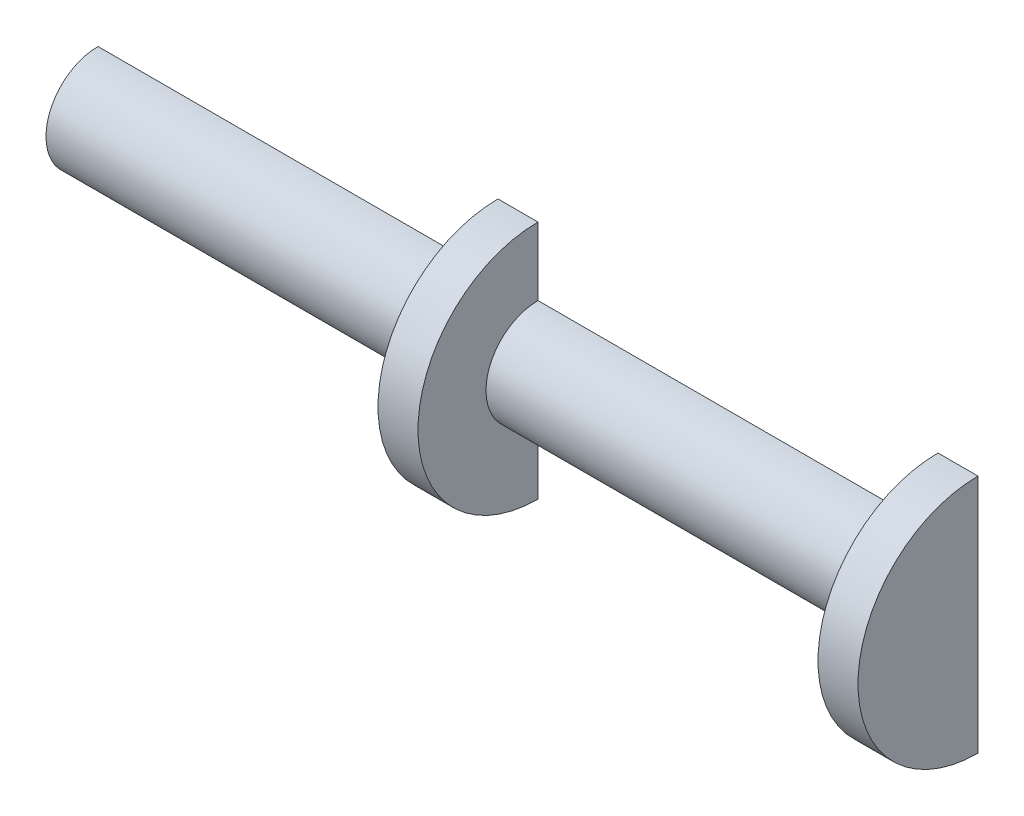
ISO-10303-21;
HEADER;
FILE_DESCRIPTION(('STEP AP214'),'2;1');
FILE_NAME('part.step','',(''),(''),'','','');
FILE_SCHEMA(('AUTOMOTIVE_DESIGN { 1 0 10303 214 1 1 1 1 }'));
ENDSEC;
DATA;
#1=APPLICATION_CONTEXT('core data for automotive mechanical design processes');
#2=APPLICATION_PROTOCOL_DEFINITION('international standard','automotive_design',2000,#1);
#3=PRODUCT_CONTEXT('',#1,'mechanical');
#4=PRODUCT('Part','Part','',(#3));
#5=PRODUCT_RELATED_PRODUCT_CATEGORY('part','',(#4));
#6=PRODUCT_DEFINITION_FORMATION('','',#4);
#7=PRODUCT_DEFINITION_CONTEXT('part definition',#1,'design');
#8=PRODUCT_DEFINITION('design','',#6,#7);
#9=PRODUCT_DEFINITION_SHAPE('','',#8);
#10=(LENGTH_UNIT() NAMED_UNIT(*) SI_UNIT(.MILLI.,.METRE.));
#11=(NAMED_UNIT(*) PLANE_ANGLE_UNIT() SI_UNIT($,.RADIAN.));
#12=(NAMED_UNIT(*) SI_UNIT($,.STERADIAN.) SOLID_ANGLE_UNIT());
#13=UNCERTAINTY_MEASURE_WITH_UNIT(LENGTH_MEASURE(1.E-05),#10,'distance_accuracy_value','');
#14=(GEOMETRIC_REPRESENTATION_CONTEXT(3) GLOBAL_UNCERTAINTY_ASSIGNED_CONTEXT((#13)) GLOBAL_UNIT_ASSIGNED_CONTEXT((#10,
#11,#12)) REPRESENTATION_CONTEXT('',''));
#15=CARTESIAN_POINT('',(0.,0.,0.));
#16=DIRECTION('',(0.,0.,1.));
#17=DIRECTION('',(1.,0.,0.));
#18=AXIS2_PLACEMENT_3D('',#15,#16,#17);
#19=CARTESIAN_POINT('',(-55.88,0.,0.));
#20=DIRECTION('',(-1.,0.,0.));
#21=DIRECTION('',(0.,0.,1.));
#22=AXIS2_PLACEMENT_3D('',#19,#20,#21);
#23=CYLINDRICAL_SURFACE('',#22,3.302);
#24=CARTESIAN_POINT('',(0.,0.,0.));
#25=DIRECTION('',(-1.,0.,0.));
#26=DIRECTION('',(0.,0.,1.));
#27=AXIS2_PLACEMENT_3D('',#24,#25,#26);
#28=CIRCLE('',#27,3.302);
#29=CARTESIAN_POINT('',(0.,-3.30200000000001,0.));
#30=VERTEX_POINT('',#29);
#31=CARTESIAN_POINT('',(0.,3.30199999999999,0.));
#32=VERTEX_POINT('',#31);
#33=EDGE_CURVE('E56',#30,#32,#28,.T.);
#34=ORIENTED_EDGE('',*,*,#33,.F.);
#35=DIRECTION('',(-1.,0.,0.));
#36=VECTOR('',#35,1.);
#37=CARTESIAN_POINT('',(-55.88,-3.30200000000001,0.));
#38=LINE('',#37,#36);
#39=CARTESIAN_POINT('',(25.4,-3.30200000000001,0.));
#40=VERTEX_POINT('',#39);
#41=EDGE_CURVE('E109',#30,#40,#38,.F.);
#42=ORIENTED_EDGE('',*,*,#41,.T.);
#43=CARTESIAN_POINT('',(25.4,0.,0.));
#44=DIRECTION('',(1.,0.,0.));
#45=DIRECTION('',(0.,0.,-1.));
#46=AXIS2_PLACEMENT_3D('',#43,#44,#45);
#47=CIRCLE('',#46,3.302);
#48=CARTESIAN_POINT('',(25.4,3.30199999999999,0.));
#49=VERTEX_POINT('',#48);
#50=EDGE_CURVE('E147',#49,#40,#47,.T.);
#51=ORIENTED_EDGE('',*,*,#50,.F.);
#52=DIRECTION('',(-1.,0.,0.));
#53=VECTOR('',#52,1.);
#54=CARTESIAN_POINT('',(-55.88,3.30199999999999,0.));
#55=LINE('',#54,#53);
#56=EDGE_CURVE('E111',#49,#32,#55,.T.);
#57=ORIENTED_EDGE('',*,*,#56,.T.);
#58=EDGE_LOOP('',(#34,#42,#51,#57));
#59=FACE_BOUND('',#58,.T.);
#60=ADVANCED_FACE('F42',(#59),#23,.T.);
#61=CARTESIAN_POINT('',(-55.88,7.61999999999999,0.));
#62=DIRECTION('',(0.,0.,1.));
#63=DIRECTION('',(1.,0.,0.));
#64=AXIS2_PLACEMENT_3D('',#61,#62,#63);
#65=PLANE('',#64);
#66=DIRECTION('',(0.,-1.,0.));
#67=VECTOR('',#66,1.);
#68=CARTESIAN_POINT('',(0.,7.61999999999999,0.));
#69=LINE('',#68,#67);
#70=EDGE_CURVE('E11',#32,#30,#69,.T.);
#71=ORIENTED_EDGE('',*,*,#70,.F.);
#72=ORIENTED_EDGE('',*,*,#56,.F.);
#73=DIRECTION('',(0.,-1.,0.));
#74=VECTOR('',#73,1.);
#75=CARTESIAN_POINT('',(25.4,3.30199999999999,0.));
#76=LINE('',#75,#74);
#77=CARTESIAN_POINT('',(25.4,7.61999999999999,0.));
#78=VERTEX_POINT('',#77);
#79=EDGE_CURVE('E120',#78,#49,#76,.T.);
#80=ORIENTED_EDGE('',*,*,#79,.F.);
#81=DIRECTION('',(1.,0.,0.));
#82=VECTOR('',#81,1.);
#83=CARTESIAN_POINT('',(-55.88,7.61999999999999,0.));
#84=LINE('',#83,#82);
#85=CARTESIAN_POINT('',(27.94,7.61999999999999,0.));
#86=VERTEX_POINT('',#85);
#87=EDGE_CURVE('E177',#78,#86,#84,.T.);
#88=ORIENTED_EDGE('',*,*,#87,.T.);
#89=DIRECTION('',(0.,1.,0.));
#90=VECTOR('',#89,1.);
#91=CARTESIAN_POINT('',(27.94,3.30199999999999,0.));
#92=LINE('',#91,#90);
#93=CARTESIAN_POINT('',(27.94,3.30199999999999,0.));
#94=VERTEX_POINT('',#93);
#95=EDGE_CURVE('E126',#94,#86,#92,.T.);
#96=ORIENTED_EDGE('',*,*,#95,.F.);
#97=DIRECTION('',(-1.,0.,0.));
#98=VECTOR('',#97,1.);
#99=CARTESIAN_POINT('',(-55.88,3.30199999999999,0.));
#100=LINE('',#99,#98);
#101=CARTESIAN_POINT('',(53.34,3.30199999999999,0.));
#102=VERTEX_POINT('',#101);
#103=EDGE_CURVE('E168',#102,#94,#100,.T.);
#104=ORIENTED_EDGE('',*,*,#103,.F.);
#105=DIRECTION('',(0.,-1.,0.));
#106=VECTOR('',#105,1.);
#107=CARTESIAN_POINT('',(53.34,3.30199999999999,0.));
#108=LINE('',#107,#106);
#109=CARTESIAN_POINT('',(53.34,7.61999999999999,0.));
#110=VERTEX_POINT('',#109);
#111=EDGE_CURVE('E162',#110,#102,#108,.T.);
#112=ORIENTED_EDGE('',*,*,#111,.F.);
#113=CARTESIAN_POINT('',(55.88,7.61999999999999,0.));
#114=VERTEX_POINT('',#113);
#115=EDGE_CURVE('E64',#110,#114,#84,.T.);
#116=ORIENTED_EDGE('',*,*,#115,.T.);
#117=DIRECTION('',(0.,-1.,0.));
#118=VECTOR('',#117,1.);
#119=CARTESIAN_POINT('',(55.88,7.61999999999999,0.));
#120=LINE('',#119,#118);
#121=CARTESIAN_POINT('',(55.88,-7.61999999999999,0.));
#122=VERTEX_POINT('',#121);
#123=EDGE_CURVE('E113',#114,#122,#120,.T.);
#124=ORIENTED_EDGE('',*,*,#123,.T.);
#125=DIRECTION('',(1.,0.,0.));
#126=VECTOR('',#125,1.);
#127=CARTESIAN_POINT('',(-55.88,-7.61999999999999,0.));
#128=LINE('',#127,#126);
#129=CARTESIAN_POINT('',(53.34,-7.61999999999999,0.));
#130=VERTEX_POINT('',#129);
#131=EDGE_CURVE('E194',#130,#122,#128,.T.);
#132=ORIENTED_EDGE('',*,*,#131,.F.);
#133=CARTESIAN_POINT('',(53.34,-3.30200000000001,0.));
#134=VERTEX_POINT('',#133);
#135=EDGE_CURVE('E160',#134,#130,#108,.T.);
#136=ORIENTED_EDGE('',*,*,#135,.F.);
#137=DIRECTION('',(-1.,0.,0.));
#138=VECTOR('',#137,1.);
#139=CARTESIAN_POINT('',(-55.88,-3.30200000000001,0.));
#140=LINE('',#139,#138);
#141=CARTESIAN_POINT('',(27.94,-3.30200000000001,0.));
#142=VERTEX_POINT('',#141);
#143=EDGE_CURVE('E169',#142,#134,#140,.F.);
#144=ORIENTED_EDGE('',*,*,#143,.F.);
#145=CARTESIAN_POINT('',(27.94,-7.61999999999999,0.));
#146=VERTEX_POINT('',#145);
#147=EDGE_CURVE('E172',#146,#142,#92,.T.);
#148=ORIENTED_EDGE('',*,*,#147,.F.);
#149=CARTESIAN_POINT('',(25.4,-7.61999999999999,0.));
#150=VERTEX_POINT('',#149);
#151=EDGE_CURVE('E192',#150,#146,#128,.T.);
#152=ORIENTED_EDGE('',*,*,#151,.F.);
#153=EDGE_CURVE('E117',#40,#150,#76,.T.);
#154=ORIENTED_EDGE('',*,*,#153,.F.);
#155=ORIENTED_EDGE('',*,*,#41,.F.);
#156=EDGE_LOOP('',(#71,#72,#80,#88,#96,#104,#112,#116,#124,#132,#136,#144,#148,#152,#154,#155));
#157=FACE_BOUND('',#156,.T.);
#158=ADVANCED_FACE('F115',(#157),#65,.F.);
#159=CARTESIAN_POINT('',(53.34,0.,0.));
#160=DIRECTION('',(1.,0.,0.));
#161=DIRECTION('',(0.,0.,-1.));
#162=AXIS2_PLACEMENT_3D('',#159,#160,#161);
#163=CIRCLE('',#162,3.302);
#164=EDGE_CURVE('E51',#102,#134,#163,.T.);
#165=ORIENTED_EDGE('',*,*,#164,.F.);
#166=ORIENTED_EDGE('',*,*,#103,.T.);
#167=CARTESIAN_POINT('',(27.94,0.,0.));
#168=DIRECTION('',(-1.,0.,0.));
#169=DIRECTION('',(0.,0.,1.));
#170=AXIS2_PLACEMENT_3D('',#167,#168,#169);
#171=CIRCLE('',#170,3.302);
#172=EDGE_CURVE('E150',#142,#94,#171,.T.);
#173=ORIENTED_EDGE('',*,*,#172,.F.);
#174=ORIENTED_EDGE('',*,*,#143,.T.);
#175=EDGE_LOOP('',(#165,#166,#173,#174));
#176=FACE_BOUND('',#175,.T.);
#177=ADVANCED_FACE('F166',(#176),#23,.T.);
#178=CARTESIAN_POINT('',(27.94,3.30199999999999,0.));
#179=DIRECTION('',(-1.,0.,0.));
#180=DIRECTION('',(0.,0.,1.));
#181=AXIS2_PLACEMENT_3D('',#178,#179,#180);
#182=PLANE('',#181);
#183=CARTESIAN_POINT('',(27.94,0.,0.));
#184=DIRECTION('',(-1.,0.,0.));
#185=DIRECTION('',(0.,0.,1.));
#186=AXIS2_PLACEMENT_3D('',#183,#184,#185);
#187=CIRCLE('',#186,7.61999999999999);
#188=EDGE_CURVE('E143',#146,#86,#187,.T.);
#189=ORIENTED_EDGE('',*,*,#188,.F.);
#190=ORIENTED_EDGE('',*,*,#147,.T.);
#191=ORIENTED_EDGE('',*,*,#172,.T.);
#192=ORIENTED_EDGE('',*,*,#95,.T.);
#193=EDGE_LOOP('',(#189,#190,#191,#192));
#194=FACE_BOUND('',#193,.T.);
#195=ADVANCED_FACE('F186',(#194),#182,.F.);
#196=CARTESIAN_POINT('',(-31.8784218922894,0.,0.));
#197=DIRECTION('',(-1.,0.,0.));
#198=DIRECTION('',(0.,0.,1.));
#199=AXIS2_PLACEMENT_3D('',#196,#197,#198);
#200=CYLINDRICAL_SURFACE('',#199,7.61999999999999);
#201=ORIENTED_EDGE('',*,*,#188,.T.);
#202=ORIENTED_EDGE('',*,*,#87,.F.);
#203=CARTESIAN_POINT('',(25.4,0.,0.));
#204=DIRECTION('',(-1.,0.,0.));
#205=DIRECTION('',(0.,0.,1.));
#206=AXIS2_PLACEMENT_3D('',#203,#204,#205);
#207=CIRCLE('',#206,7.61999999999999);
#208=EDGE_CURVE('E139',#150,#78,#207,.T.);
#209=ORIENTED_EDGE('',*,*,#208,.F.);
#210=ORIENTED_EDGE('',*,*,#151,.T.);
#211=EDGE_LOOP('',(#201,#202,#209,#210));
#212=FACE_BOUND('',#211,.T.);
#213=ADVANCED_FACE('F190',(#212),#200,.T.);
#214=CARTESIAN_POINT('',(25.4,3.30199999999999,0.));
#215=DIRECTION('',(1.,0.,0.));
#216=DIRECTION('',(0.,0.,-1.));
#217=AXIS2_PLACEMENT_3D('',#214,#215,#216);
#218=PLANE('',#217);
#219=ORIENTED_EDGE('',*,*,#208,.T.);
#220=ORIENTED_EDGE('',*,*,#79,.T.);
#221=ORIENTED_EDGE('',*,*,#50,.T.);
#222=ORIENTED_EDGE('',*,*,#153,.T.);
#223=EDGE_LOOP('',(#219,#220,#221,#222));
#224=FACE_BOUND('',#223,.T.);
#225=ADVANCED_FACE('F226',(#224),#218,.F.);
#226=CARTESIAN_POINT('',(53.34,3.30199999999999,0.));
#227=DIRECTION('',(1.,0.,0.));
#228=DIRECTION('',(0.,0.,-1.));
#229=AXIS2_PLACEMENT_3D('',#226,#227,#228);
#230=PLANE('',#229);
#231=CARTESIAN_POINT('',(53.34,0.,0.));
#232=DIRECTION('',(-1.,0.,0.));
#233=DIRECTION('',(0.,0.,1.));
#234=AXIS2_PLACEMENT_3D('',#231,#232,#233);
#235=CIRCLE('',#234,7.61999999999999);
#236=EDGE_CURVE('E135',#130,#110,#235,.T.);
#237=ORIENTED_EDGE('',*,*,#236,.T.);
#238=ORIENTED_EDGE('',*,*,#111,.T.);
#239=ORIENTED_EDGE('',*,*,#164,.T.);
#240=ORIENTED_EDGE('',*,*,#135,.T.);
#241=EDGE_LOOP('',(#237,#238,#239,#240));
#242=FACE_BOUND('',#241,.T.);
#243=ADVANCED_FACE('F159',(#242),#230,.F.);
#244=CARTESIAN_POINT('',(-31.8784218922894,0.,0.));
#245=DIRECTION('',(-1.,0.,0.));
#246=DIRECTION('',(0.,0.,1.));
#247=AXIS2_PLACEMENT_3D('',#244,#245,#246);
#248=CYLINDRICAL_SURFACE('',#247,7.61999999999999);
#249=CARTESIAN_POINT('',(55.88,0.,0.));
#250=DIRECTION('',(-1.,0.,0.));
#251=DIRECTION('',(0.,0.,1.));
#252=AXIS2_PLACEMENT_3D('',#249,#250,#251);
#253=CIRCLE('',#252,7.61999999999999);
#254=EDGE_CURVE('E131',#122,#114,#253,.T.);
#255=ORIENTED_EDGE('',*,*,#254,.T.);
#256=ORIENTED_EDGE('',*,*,#115,.F.);
#257=ORIENTED_EDGE('',*,*,#236,.F.);
#258=ORIENTED_EDGE('',*,*,#131,.T.);
#259=EDGE_LOOP('',(#255,#256,#257,#258));
#260=FACE_BOUND('',#259,.T.);
#261=ADVANCED_FACE('F204',(#260),#248,.T.);
#262=CARTESIAN_POINT('',(55.88,3.30199999999999,0.));
#263=DIRECTION('',(-1.,0.,0.));
#264=DIRECTION('',(0.,0.,1.));
#265=AXIS2_PLACEMENT_3D('',#262,#263,#264);
#266=PLANE('',#265);
#267=ORIENTED_EDGE('',*,*,#254,.F.);
#268=ORIENTED_EDGE('',*,*,#123,.F.);
#269=EDGE_LOOP('',(#267,#268));
#270=FACE_BOUND('',#269,.T.);
#271=ADVANCED_FACE('F44',(#270),#266,.F.);
#272=CARTESIAN_POINT('',(0.,-7.61999999999999,7.61999999999999));
#273=DIRECTION('',(-1.,0.,0.));
#274=DIRECTION('',(0.,0.,1.));
#275=AXIS2_PLACEMENT_3D('',#272,#273,#274);
#276=PLANE('',#275);
#277=ORIENTED_EDGE('',*,*,#33,.T.);
#278=ORIENTED_EDGE('',*,*,#70,.T.);
#279=EDGE_LOOP('',(#277,#278));
#280=FACE_BOUND('',#279,.T.);
#281=ADVANCED_FACE('F104',(#280),#276,.T.);
#282=CLOSED_SHELL('',(#60,#158,#177,#195,#213,#225,#243,#261,#271,#281));
#283=MANIFOLD_SOLID_BREP('B2',#282);
#284=ADVANCED_BREP_SHAPE_REPRESENTATION('',(#18,#283),#14);
#285=SHAPE_DEFINITION_REPRESENTATION(#9,#284);
ENDSEC;
END-ISO-10303-21;
